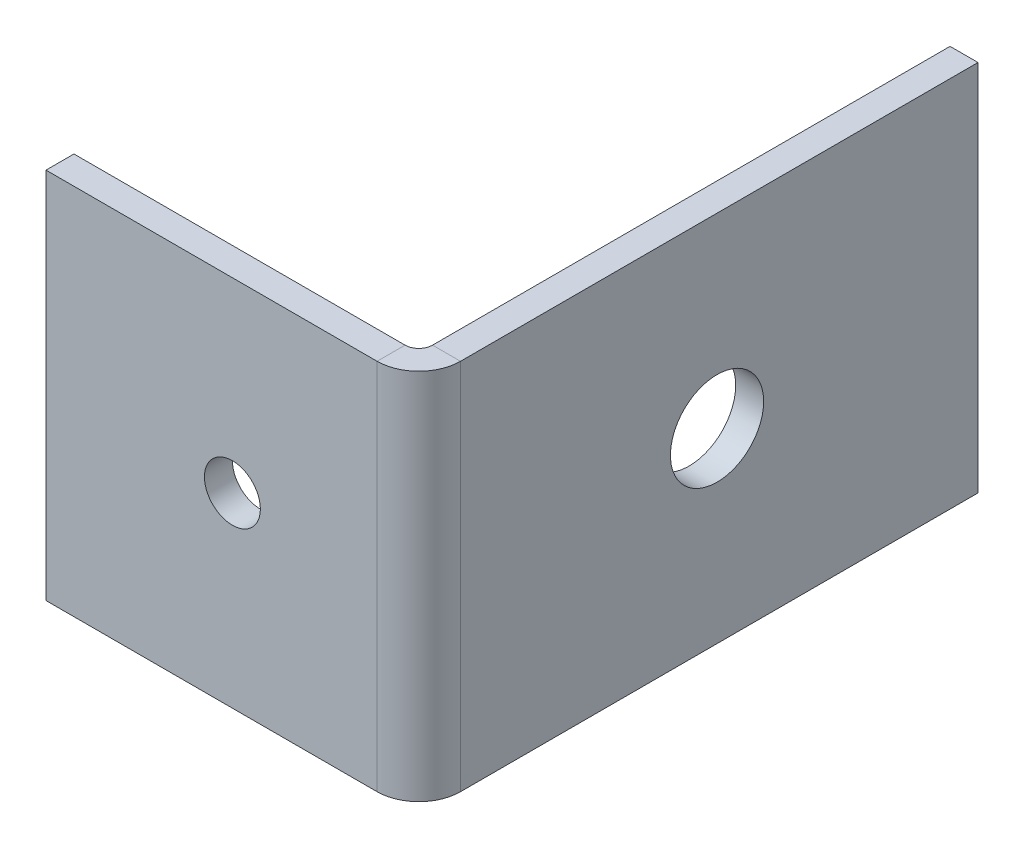
ISO-10303-21;
HEADER;
FILE_DESCRIPTION(('STEP AP214'),'2;1');
FILE_NAME('part.step','',(''),(''),'','','');
FILE_SCHEMA(('AUTOMOTIVE_DESIGN { 1 0 10303 214 1 1 1 1 }'));
ENDSEC;
DATA;
#1=APPLICATION_CONTEXT('core data for automotive mechanical design processes');
#2=APPLICATION_PROTOCOL_DEFINITION('international standard','automotive_design',2000,#1);
#3=PRODUCT_CONTEXT('',#1,'mechanical');
#4=PRODUCT('Part','Part','',(#3));
#5=PRODUCT_RELATED_PRODUCT_CATEGORY('part','',(#4));
#6=PRODUCT_DEFINITION_FORMATION('','',#4);
#7=PRODUCT_DEFINITION_CONTEXT('part definition',#1,'design');
#8=PRODUCT_DEFINITION('design','',#6,#7);
#9=PRODUCT_DEFINITION_SHAPE('','',#8);
#10=(LENGTH_UNIT() NAMED_UNIT(*) SI_UNIT(.MILLI.,.METRE.));
#11=(NAMED_UNIT(*) PLANE_ANGLE_UNIT() SI_UNIT($,.RADIAN.));
#12=(NAMED_UNIT(*) SI_UNIT($,.STERADIAN.) SOLID_ANGLE_UNIT());
#13=UNCERTAINTY_MEASURE_WITH_UNIT(LENGTH_MEASURE(1.E-05),#10,'distance_accuracy_value','');
#14=(GEOMETRIC_REPRESENTATION_CONTEXT(3) GLOBAL_UNCERTAINTY_ASSIGNED_CONTEXT((#13)) GLOBAL_UNIT_ASSIGNED_CONTEXT((#10,
#11,#12)) REPRESENTATION_CONTEXT('',''));
#15=CARTESIAN_POINT('',(0.,0.,0.));
#16=DIRECTION('',(0.,0.,1.));
#17=DIRECTION('',(1.,0.,0.));
#18=AXIS2_PLACEMENT_3D('',#15,#16,#17);
#19=CARTESIAN_POINT('',(-2.2366,20.,30.));
#20=DIRECTION('',(0.,1.,0.));
#21=DIRECTION('',(0.,0.,1.));
#22=AXIS2_PLACEMENT_3D('',#19,#20,#21);
#23=PLANE('',#22);
#24=DIRECTION('',(0.,0.,-1.));
#25=VECTOR('',#24,1.);
#26=CARTESIAN_POINT('',(-2.2366,20.,30.));
#27=LINE('',#26,#25);
#28=CARTESIAN_POINT('',(-2.2366,20.,30.));
#29=VERTEX_POINT('',#28);
#30=CARTESIAN_POINT('',(-2.2366,20.,28.5));
#31=VERTEX_POINT('',#30);
#32=EDGE_CURVE('E13',#29,#31,#27,.T.);
#33=ORIENTED_EDGE('',*,*,#32,.F.);
#34=CARTESIAN_POINT('',(-2.2366,20.,27.7634));
#35=DIRECTION('',(0.,1.,0.));
#36=DIRECTION('',(0.,0.,1.));
#37=AXIS2_PLACEMENT_3D('',#34,#35,#36);
#38=CIRCLE('',#37,2.2366);
#39=CARTESIAN_POINT('',(0.,20.,27.7634));
#40=VERTEX_POINT('',#39);
#41=EDGE_CURVE('E147',#40,#29,#38,.F.);
#42=ORIENTED_EDGE('',*,*,#41,.F.);
#43=DIRECTION('',(1.,0.,0.));
#44=VECTOR('',#43,1.);
#45=CARTESIAN_POINT('',(-1.5,20.,27.7634));
#46=LINE('',#45,#44);
#47=CARTESIAN_POINT('',(-1.5,20.,27.7634));
#48=VERTEX_POINT('',#47);
#49=EDGE_CURVE('E58',#48,#40,#46,.T.);
#50=ORIENTED_EDGE('',*,*,#49,.F.);
#51=CARTESIAN_POINT('',(-2.2366,20.,27.7634));
#52=DIRECTION('',(0.,1.,0.));
#53=DIRECTION('',(1.,0.,0.));
#54=AXIS2_PLACEMENT_3D('',#51,#52,#53);
#55=CIRCLE('',#54,0.7366);
#56=EDGE_CURVE('E140',#48,#31,#55,.F.);
#57=ORIENTED_EDGE('',*,*,#56,.T.);
#58=EDGE_LOOP('',(#33,#42,#50,#57));
#59=FACE_BOUND('',#58,.T.);
#60=ADVANCED_FACE('F50',(#59),#23,.T.);
#61=CARTESIAN_POINT('',(-1.5,20.,27.7634));
#62=DIRECTION('',(0.,1.,0.));
#63=DIRECTION('',(0.,0.,1.));
#64=AXIS2_PLACEMENT_3D('',#61,#62,#63);
#65=PLANE('',#64);
#66=DIRECTION('',(-1.,0.,0.));
#67=VECTOR('',#66,1.);
#68=CARTESIAN_POINT('',(0.,20.,30.));
#69=LINE('',#68,#67);
#70=CARTESIAN_POINT('',(-20.,20.,30.));
#71=VERTEX_POINT('',#70);
#72=EDGE_CURVE('E197',#29,#71,#69,.T.);
#73=ORIENTED_EDGE('',*,*,#72,.F.);
#74=ORIENTED_EDGE('',*,*,#32,.T.);
#75=DIRECTION('',(1.,0.,0.));
#76=VECTOR('',#75,1.);
#77=CARTESIAN_POINT('',(0.,20.,28.5));
#78=LINE('',#77,#76);
#79=CARTESIAN_POINT('',(-20.,20.,28.5));
#80=VERTEX_POINT('',#79);
#81=EDGE_CURVE('E106',#31,#80,#78,.F.);
#82=ORIENTED_EDGE('',*,*,#81,.T.);
#83=DIRECTION('',(0.,0.,-1.));
#84=VECTOR('',#83,1.);
#85=CARTESIAN_POINT('',(-20.,20.,30.));
#86=LINE('',#85,#84);
#87=EDGE_CURVE('E372',#71,#80,#86,.T.);
#88=ORIENTED_EDGE('',*,*,#87,.F.);
#89=EDGE_LOOP('',(#73,#74,#82,#88));
#90=FACE_BOUND('',#89,.T.);
#91=ADVANCED_FACE('F205',(#90),#65,.T.);
#92=CARTESIAN_POINT('',(0.,0.,27.7634));
#93=DIRECTION('',(0.,-1.,0.));
#94=DIRECTION('',(0.,0.,-1.));
#95=AXIS2_PLACEMENT_3D('',#92,#93,#94);
#96=PLANE('',#95);
#97=DIRECTION('',(-1.,0.,0.));
#98=VECTOR('',#97,1.);
#99=CARTESIAN_POINT('',(0.,0.,27.7634));
#100=LINE('',#99,#98);
#101=CARTESIAN_POINT('',(0.,0.,27.7634));
#102=VERTEX_POINT('',#101);
#103=CARTESIAN_POINT('',(-1.5,0.,27.7634));
#104=VERTEX_POINT('',#103);
#105=EDGE_CURVE('E93',#102,#104,#100,.T.);
#106=ORIENTED_EDGE('',*,*,#105,.F.);
#107=CARTESIAN_POINT('',(-2.2366,0.,27.7634));
#108=DIRECTION('',(0.,1.,0.));
#109=DIRECTION('',(0.,0.,1.));
#110=AXIS2_PLACEMENT_3D('',#107,#108,#109);
#111=CIRCLE('',#110,2.2366);
#112=CARTESIAN_POINT('',(-2.2366,0.,30.));
#113=VERTEX_POINT('',#112);
#114=EDGE_CURVE('E163',#102,#113,#111,.F.);
#115=ORIENTED_EDGE('',*,*,#114,.T.);
#116=DIRECTION('',(0.,0.,1.));
#117=VECTOR('',#116,1.);
#118=CARTESIAN_POINT('',(-2.2366,0.,28.5));
#119=LINE('',#118,#117);
#120=CARTESIAN_POINT('',(-2.2366,0.,28.5));
#121=VERTEX_POINT('',#120);
#122=EDGE_CURVE('E100',#121,#113,#119,.T.);
#123=ORIENTED_EDGE('',*,*,#122,.F.);
#124=CARTESIAN_POINT('',(-2.2366,0.,27.7634));
#125=DIRECTION('',(0.,1.,0.));
#126=DIRECTION('',(1.,0.,0.));
#127=AXIS2_PLACEMENT_3D('',#124,#125,#126);
#128=CIRCLE('',#127,0.7366);
#129=EDGE_CURVE('E170',#104,#121,#128,.F.);
#130=ORIENTED_EDGE('',*,*,#129,.F.);
#131=EDGE_LOOP('',(#106,#115,#123,#130));
#132=FACE_BOUND('',#131,.T.);
#133=ADVANCED_FACE('F203',(#132),#96,.T.);
#134=CARTESIAN_POINT('',(-2.2366,0.,28.5));
#135=DIRECTION('',(0.,-1.,0.));
#136=DIRECTION('',(0.,0.,-1.));
#137=AXIS2_PLACEMENT_3D('',#134,#135,#136);
#138=PLANE('',#137);
#139=DIRECTION('',(0.,0.,1.));
#140=VECTOR('',#139,1.);
#141=CARTESIAN_POINT('',(0.,0.,0.));
#142=LINE('',#141,#140);
#143=CARTESIAN_POINT('',(0.,0.,0.));
#144=VERTEX_POINT('',#143);
#145=EDGE_CURVE('E165',#144,#102,#142,.T.);
#146=ORIENTED_EDGE('',*,*,#145,.T.);
#147=ORIENTED_EDGE('',*,*,#105,.T.);
#148=DIRECTION('',(0.,0.,-1.));
#149=VECTOR('',#148,1.);
#150=CARTESIAN_POINT('',(-1.5,0.,0.));
#151=LINE('',#150,#149);
#152=CARTESIAN_POINT('',(-1.5,0.,0.));
#153=VERTEX_POINT('',#152);
#154=EDGE_CURVE('E168',#153,#104,#151,.F.);
#155=ORIENTED_EDGE('',*,*,#154,.F.);
#156=DIRECTION('',(1.,0.,0.));
#157=VECTOR('',#156,1.);
#158=CARTESIAN_POINT('',(-1.5,0.,0.));
#159=LINE('',#158,#157);
#160=EDGE_CURVE('E128',#153,#144,#159,.T.);
#161=ORIENTED_EDGE('',*,*,#160,.T.);
#162=EDGE_LOOP('',(#146,#147,#155,#161));
#163=FACE_BOUND('',#162,.T.);
#164=ADVANCED_FACE('F199',(#163),#138,.T.);
#165=CARTESIAN_POINT('',(0.,20.,28.5));
#166=DIRECTION('',(0.,0.,1.));
#167=DIRECTION('',(1.,0.,0.));
#168=AXIS2_PLACEMENT_3D('',#165,#166,#167);
#169=PLANE('',#168);
#170=CARTESIAN_POINT('',(-10.,10.,28.5));
#171=DIRECTION('',(0.,0.,-1.));
#172=DIRECTION('',(-1.,0.,0.));
#173=AXIS2_PLACEMENT_3D('',#170,#171,#172);
#174=CIRCLE('',#173,1.5);
#175=CARTESIAN_POINT('',(-11.5,10.,28.5));
#176=VERTEX_POINT('',#175);
#177=EDGE_CURVE('E359',#176,#176,#174,.T.);
#178=ORIENTED_EDGE('',*,*,#177,.F.);
#179=EDGE_LOOP('',(#178));
#180=FACE_BOUND('',#179,.T.);
#181=DIRECTION('',(1.,0.,0.));
#182=VECTOR('',#181,1.);
#183=CARTESIAN_POINT('',(0.,0.,28.5));
#184=LINE('',#183,#182);
#185=CARTESIAN_POINT('',(-20.,0.,28.5));
#186=VERTEX_POINT('',#185);
#187=EDGE_CURVE('E153',#121,#186,#184,.F.);
#188=ORIENTED_EDGE('',*,*,#187,.T.);
#189=DIRECTION('',(0.,-1.,0.));
#190=VECTOR('',#189,1.);
#191=CARTESIAN_POINT('',(-20.,20.,28.5));
#192=LINE('',#191,#190);
#193=EDGE_CURVE('E184',#80,#186,#192,.T.);
#194=ORIENTED_EDGE('',*,*,#193,.F.);
#195=ORIENTED_EDGE('',*,*,#81,.F.);
#196=DIRECTION('',(0.,-1.,0.));
#197=VECTOR('',#196,1.);
#198=CARTESIAN_POINT('',(-2.2366,20.,28.5));
#199=LINE('',#198,#197);
#200=EDGE_CURVE('E152',#31,#121,#199,.T.);
#201=ORIENTED_EDGE('',*,*,#200,.T.);
#202=EDGE_LOOP('',(#188,#194,#195,#201));
#203=FACE_BOUND('',#202,.T.);
#204=ADVANCED_FACE('F211',(#180,#203),#169,.F.);
#205=CARTESIAN_POINT('',(-20.,20.,30.));
#206=DIRECTION('',(-1.,0.,0.));
#207=DIRECTION('',(0.,0.,1.));
#208=AXIS2_PLACEMENT_3D('',#205,#206,#207);
#209=PLANE('',#208);
#210=DIRECTION('',(0.,0.,-1.));
#211=VECTOR('',#210,1.);
#212=CARTESIAN_POINT('',(-20.,0.,30.));
#213=LINE('',#212,#211);
#214=CARTESIAN_POINT('',(-20.,0.,30.));
#215=VERTEX_POINT('',#214);
#216=EDGE_CURVE('E156',#215,#186,#213,.T.);
#217=ORIENTED_EDGE('',*,*,#216,.F.);
#218=DIRECTION('',(0.,-1.,0.));
#219=VECTOR('',#218,1.);
#220=CARTESIAN_POINT('',(-20.,20.,30.));
#221=LINE('',#220,#219);
#222=EDGE_CURVE('E182',#71,#215,#221,.T.);
#223=ORIENTED_EDGE('',*,*,#222,.F.);
#224=ORIENTED_EDGE('',*,*,#87,.T.);
#225=ORIENTED_EDGE('',*,*,#193,.T.);
#226=EDGE_LOOP('',(#217,#223,#224,#225));
#227=FACE_BOUND('',#226,.T.);
#228=ADVANCED_FACE('F240',(#227),#209,.T.);
#229=CARTESIAN_POINT('',(0.,20.,30.));
#230=DIRECTION('',(0.,0.,1.));
#231=DIRECTION('',(1.,0.,0.));
#232=AXIS2_PLACEMENT_3D('',#229,#230,#231);
#233=PLANE('',#232);
#234=CARTESIAN_POINT('',(-10.,10.,30.));
#235=DIRECTION('',(0.,0.,1.));
#236=DIRECTION('',(1.,0.,0.));
#237=AXIS2_PLACEMENT_3D('',#234,#235,#236);
#238=CIRCLE('',#237,1.5);
#239=CARTESIAN_POINT('',(-8.5,10.,30.));
#240=VERTEX_POINT('',#239);
#241=EDGE_CURVE('E362',#240,#240,#238,.T.);
#242=ORIENTED_EDGE('',*,*,#241,.F.);
#243=EDGE_LOOP('',(#242));
#244=FACE_BOUND('',#243,.T.);
#245=DIRECTION('',(-1.,0.,0.));
#246=VECTOR('',#245,1.);
#247=CARTESIAN_POINT('',(0.,0.,30.));
#248=LINE('',#247,#246);
#249=EDGE_CURVE('E160',#113,#215,#248,.T.);
#250=ORIENTED_EDGE('',*,*,#249,.F.);
#251=DIRECTION('',(0.,-1.,0.));
#252=VECTOR('',#251,1.);
#253=CARTESIAN_POINT('',(-2.2366,20.,30.));
#254=LINE('',#253,#252);
#255=EDGE_CURVE('E179',#29,#113,#254,.T.);
#256=ORIENTED_EDGE('',*,*,#255,.F.);
#257=ORIENTED_EDGE('',*,*,#72,.T.);
#258=ORIENTED_EDGE('',*,*,#222,.T.);
#259=EDGE_LOOP('',(#250,#256,#257,#258));
#260=FACE_BOUND('',#259,.T.);
#261=ADVANCED_FACE('F245',(#244,#260),#233,.T.);
#262=CARTESIAN_POINT('',(-2.2366,20.,27.7634));
#263=DIRECTION('',(0.,-1.,0.));
#264=DIRECTION('',(0.,0.,-1.));
#265=AXIS2_PLACEMENT_3D('',#262,#263,#264);
#266=CYLINDRICAL_SURFACE('',#265,2.2366);
#267=ORIENTED_EDGE('',*,*,#114,.F.);
#268=DIRECTION('',(0.,-1.,0.));
#269=VECTOR('',#268,1.);
#270=CARTESIAN_POINT('',(0.,20.,27.7634));
#271=LINE('',#270,#269);
#272=EDGE_CURVE('E176',#40,#102,#271,.T.);
#273=ORIENTED_EDGE('',*,*,#272,.F.);
#274=ORIENTED_EDGE('',*,*,#41,.T.);
#275=ORIENTED_EDGE('',*,*,#255,.T.);
#276=EDGE_LOOP('',(#267,#273,#274,#275));
#277=FACE_BOUND('',#276,.T.);
#278=ADVANCED_FACE('F193',(#277),#266,.T.);
#279=CARTESIAN_POINT('',(0.,20.,0.));
#280=DIRECTION('',(1.,0.,0.));
#281=DIRECTION('',(0.,0.,-1.));
#282=AXIS2_PLACEMENT_3D('',#279,#280,#281);
#283=PLANE('',#282);
#284=CARTESIAN_POINT('',(0.,10.,14.));
#285=DIRECTION('',(1.,0.,0.));
#286=DIRECTION('',(0.,0.,-1.));
#287=AXIS2_PLACEMENT_3D('',#284,#285,#286);
#288=CIRCLE('',#287,2.49999999999999);
#289=CARTESIAN_POINT('',(0.,10.,11.5));
#290=VERTEX_POINT('',#289);
#291=EDGE_CURVE('E363',#290,#290,#288,.T.);
#292=ORIENTED_EDGE('',*,*,#291,.F.);
#293=EDGE_LOOP('',(#292));
#294=FACE_BOUND('',#293,.T.);
#295=ORIENTED_EDGE('',*,*,#145,.F.);
#296=DIRECTION('',(0.,-1.,0.));
#297=VECTOR('',#296,1.);
#298=CARTESIAN_POINT('',(0.,20.,0.));
#299=LINE('',#298,#297);
#300=CARTESIAN_POINT('',(0.,20.,0.));
#301=VERTEX_POINT('',#300);
#302=EDGE_CURVE('E130',#301,#144,#299,.T.);
#303=ORIENTED_EDGE('',*,*,#302,.F.);
#304=DIRECTION('',(0.,0.,1.));
#305=VECTOR('',#304,1.);
#306=CARTESIAN_POINT('',(0.,20.,0.));
#307=LINE('',#306,#305);
#308=EDGE_CURVE('E145',#301,#40,#307,.T.);
#309=ORIENTED_EDGE('',*,*,#308,.T.);
#310=ORIENTED_EDGE('',*,*,#272,.T.);
#311=EDGE_LOOP('',(#295,#303,#309,#310));
#312=FACE_BOUND('',#311,.T.);
#313=ADVANCED_FACE('F198',(#294,#312),#283,.T.);
#314=CARTESIAN_POINT('',(-1.5,20.,0.));
#315=DIRECTION('',(0.,0.,-1.));
#316=DIRECTION('',(-1.,0.,0.));
#317=AXIS2_PLACEMENT_3D('',#314,#315,#316);
#318=PLANE('',#317);
#319=ORIENTED_EDGE('',*,*,#160,.F.);
#320=DIRECTION('',(0.,-1.,0.));
#321=VECTOR('',#320,1.);
#322=CARTESIAN_POINT('',(-1.5,20.,0.));
#323=LINE('',#322,#321);
#324=CARTESIAN_POINT('',(-1.5,20.,0.));
#325=VERTEX_POINT('',#324);
#326=EDGE_CURVE('E122',#325,#153,#323,.T.);
#327=ORIENTED_EDGE('',*,*,#326,.F.);
#328=DIRECTION('',(1.,0.,0.));
#329=VECTOR('',#328,1.);
#330=CARTESIAN_POINT('',(-1.5,20.,0.));
#331=LINE('',#330,#329);
#332=EDGE_CURVE('E126',#325,#301,#331,.T.);
#333=ORIENTED_EDGE('',*,*,#332,.T.);
#334=ORIENTED_EDGE('',*,*,#302,.T.);
#335=EDGE_LOOP('',(#319,#327,#333,#334));
#336=FACE_BOUND('',#335,.T.);
#337=ADVANCED_FACE('F124',(#336),#318,.T.);
#338=CARTESIAN_POINT('',(-1.5,20.,0.));
#339=DIRECTION('',(1.,0.,0.));
#340=DIRECTION('',(0.,0.,-1.));
#341=AXIS2_PLACEMENT_3D('',#338,#339,#340);
#342=PLANE('',#341);
#343=CARTESIAN_POINT('',(-1.5,10.,14.));
#344=DIRECTION('',(1.,0.,0.));
#345=DIRECTION('',(0.,0.,-1.));
#346=AXIS2_PLACEMENT_3D('',#343,#344,#345);
#347=CIRCLE('',#346,2.49999999999999);
#348=CARTESIAN_POINT('',(-1.5,10.,11.5));
#349=VERTEX_POINT('',#348);
#350=EDGE_CURVE('E157',#349,#349,#347,.T.);
#351=ORIENTED_EDGE('',*,*,#350,.T.);
#352=EDGE_LOOP('',(#351));
#353=FACE_BOUND('',#352,.T.);
#354=ORIENTED_EDGE('',*,*,#154,.T.);
#355=DIRECTION('',(0.,-1.,0.));
#356=VECTOR('',#355,1.);
#357=CARTESIAN_POINT('',(-1.5,20.,27.7634));
#358=LINE('',#357,#356);
#359=EDGE_CURVE('E131',#48,#104,#358,.T.);
#360=ORIENTED_EDGE('',*,*,#359,.F.);
#361=DIRECTION('',(0.,0.,-1.));
#362=VECTOR('',#361,1.);
#363=CARTESIAN_POINT('',(-1.5,20.,0.));
#364=LINE('',#363,#362);
#365=EDGE_CURVE('E135',#325,#48,#364,.F.);
#366=ORIENTED_EDGE('',*,*,#365,.F.);
#367=ORIENTED_EDGE('',*,*,#326,.T.);
#368=EDGE_LOOP('',(#354,#360,#366,#367));
#369=FACE_BOUND('',#368,.T.);
#370=ADVANCED_FACE('F136',(#353,#369),#342,.F.);
#371=CARTESIAN_POINT('',(-2.2366,20.,27.7634));
#372=DIRECTION('',(0.,-1.,0.));
#373=DIRECTION('',(0.,0.,-1.));
#374=AXIS2_PLACEMENT_3D('',#371,#372,#373);
#375=CYLINDRICAL_SURFACE('',#374,0.7366);
#376=ORIENTED_EDGE('',*,*,#129,.T.);
#377=ORIENTED_EDGE('',*,*,#200,.F.);
#378=ORIENTED_EDGE('',*,*,#56,.F.);
#379=ORIENTED_EDGE('',*,*,#359,.T.);
#380=EDGE_LOOP('',(#376,#377,#378,#379));
#381=FACE_BOUND('',#380,.T.);
#382=ADVANCED_FACE('F201',(#381),#375,.F.);
#383=CARTESIAN_POINT('',(-2.2366,20.,27.7634));
#384=DIRECTION('',(0.,1.,0.));
#385=DIRECTION('',(1.,0.,0.));
#386=AXIS2_PLACEMENT_3D('',#383,#384,#385);
#387=PLANE('',#386);
#388=ORIENTED_EDGE('',*,*,#365,.T.);
#389=ORIENTED_EDGE('',*,*,#49,.T.);
#390=ORIENTED_EDGE('',*,*,#308,.F.);
#391=ORIENTED_EDGE('',*,*,#332,.F.);
#392=EDGE_LOOP('',(#388,#389,#390,#391));
#393=FACE_BOUND('',#392,.T.);
#394=ADVANCED_FACE('F143',(#393),#387,.T.);
#395=CARTESIAN_POINT('',(-2.2366,0.,27.7634));
#396=DIRECTION('',(0.,1.,0.));
#397=DIRECTION('',(1.,0.,0.));
#398=AXIS2_PLACEMENT_3D('',#395,#396,#397);
#399=PLANE('',#398);
#400=ORIENTED_EDGE('',*,*,#187,.F.);
#401=ORIENTED_EDGE('',*,*,#122,.T.);
#402=ORIENTED_EDGE('',*,*,#249,.T.);
#403=ORIENTED_EDGE('',*,*,#216,.T.);
#404=EDGE_LOOP('',(#400,#401,#402,#403));
#405=FACE_BOUND('',#404,.T.);
#406=ADVANCED_FACE('F289',(#405),#399,.F.);
#407=CARTESIAN_POINT('',(0.,10.,14.));
#408=DIRECTION('',(1.,0.,0.));
#409=DIRECTION('',(0.,0.,-1.));
#410=AXIS2_PLACEMENT_3D('',#407,#408,#409);
#411=CYLINDRICAL_SURFACE('',#410,2.49999999999999);
#412=ORIENTED_EDGE('',*,*,#350,.F.);
#413=EDGE_LOOP('',(#412));
#414=FACE_BOUND('',#413,.T.);
#415=ORIENTED_EDGE('',*,*,#291,.T.);
#416=EDGE_LOOP('',(#415));
#417=FACE_BOUND('',#416,.T.);
#418=ADVANCED_FACE('F299',(#414,#417),#411,.F.);
#419=CARTESIAN_POINT('',(-10.,10.,28.5));
#420=DIRECTION('',(0.,0.,-1.));
#421=DIRECTION('',(-1.,0.,0.));
#422=AXIS2_PLACEMENT_3D('',#419,#420,#421);
#423=CYLINDRICAL_SURFACE('',#422,1.5);
#424=ORIENTED_EDGE('',*,*,#177,.T.);
#425=EDGE_LOOP('',(#424));
#426=FACE_BOUND('',#425,.T.);
#427=ORIENTED_EDGE('',*,*,#241,.T.);
#428=EDGE_LOOP('',(#427));
#429=FACE_BOUND('',#428,.T.);
#430=ADVANCED_FACE('F326',(#426,#429),#423,.F.);
#431=CLOSED_SHELL('',(#60,#91,#133,#164,#204,#228,#261,#278,#313,#337,#370,#382,#394,#406,#418,#430));
#432=MANIFOLD_SOLID_BREP('B2',#431);
#433=ADVANCED_BREP_SHAPE_REPRESENTATION('',(#18,#432),#14);
#434=SHAPE_DEFINITION_REPRESENTATION(#9,#433);
ENDSEC;
END-ISO-10303-21;
